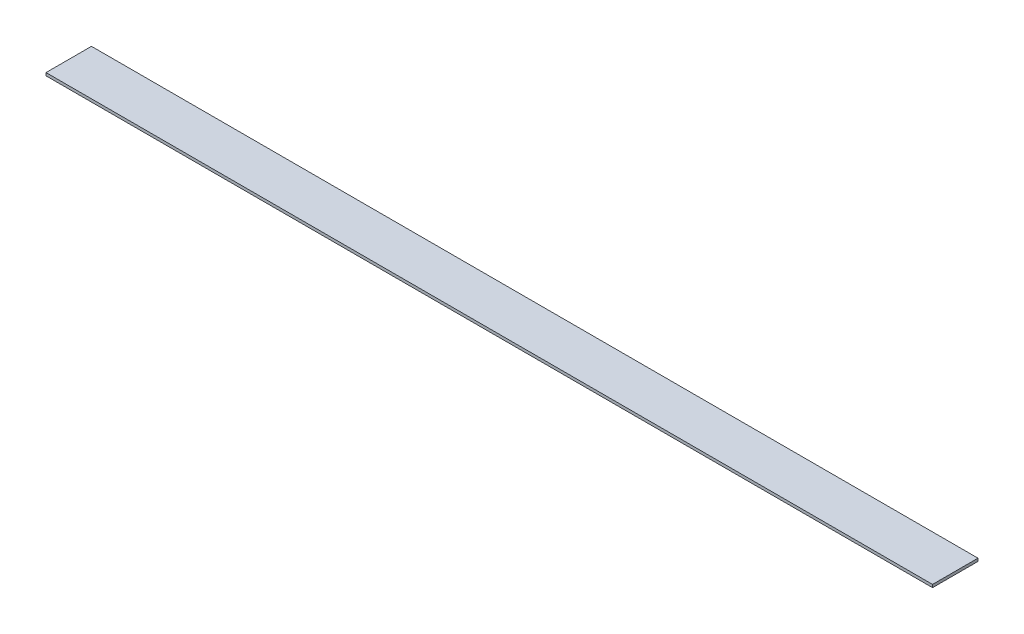
ISO-10303-21;
HEADER;
FILE_DESCRIPTION(('STEP AP214'),'2;1');
FILE_NAME('part.step','',(''),(''),'','','');
FILE_SCHEMA(('AUTOMOTIVE_DESIGN { 1 0 10303 214 1 1 1 1 }'));
ENDSEC;
DATA;
#1=APPLICATION_CONTEXT('core data for automotive mechanical design processes');
#2=APPLICATION_PROTOCOL_DEFINITION('international standard','automotive_design',2000,#1);
#3=PRODUCT_CONTEXT('',#1,'mechanical');
#4=PRODUCT('Part','Part','',(#3));
#5=PRODUCT_RELATED_PRODUCT_CATEGORY('part','',(#4));
#6=PRODUCT_DEFINITION_FORMATION('','',#4);
#7=PRODUCT_DEFINITION_CONTEXT('part definition',#1,'design');
#8=PRODUCT_DEFINITION('design','',#6,#7);
#9=PRODUCT_DEFINITION_SHAPE('','',#8);
#10=(LENGTH_UNIT() NAMED_UNIT(*) SI_UNIT(.MILLI.,.METRE.));
#11=(NAMED_UNIT(*) PLANE_ANGLE_UNIT() SI_UNIT($,.RADIAN.));
#12=(NAMED_UNIT(*) SI_UNIT($,.STERADIAN.) SOLID_ANGLE_UNIT());
#13=UNCERTAINTY_MEASURE_WITH_UNIT(LENGTH_MEASURE(1.E-05),#10,'distance_accuracy_value','');
#14=(GEOMETRIC_REPRESENTATION_CONTEXT(3) GLOBAL_UNCERTAINTY_ASSIGNED_CONTEXT((#13)) GLOBAL_UNIT_ASSIGNED_CONTEXT((#10,
#11,#12)) REPRESENTATION_CONTEXT('',''));
#15=CARTESIAN_POINT('',(0.,0.,0.));
#16=DIRECTION('',(0.,0.,1.));
#17=DIRECTION('',(1.,0.,0.));
#18=AXIS2_PLACEMENT_3D('',#15,#16,#17);
#19=CARTESIAN_POINT('',(-495.3,3.175,25.4000000000001));
#20=DIRECTION('',(1.,0.,0.));
#21=DIRECTION('',(0.,0.,-1.));
#22=AXIS2_PLACEMENT_3D('',#19,#20,#21);
#23=PLANE('',#22);
#24=DIRECTION('',(0.,0.,1.));
#25=VECTOR('',#24,1.);
#26=CARTESIAN_POINT('',(-495.3,0.,25.4000000000001));
#27=LINE('',#26,#25);
#28=CARTESIAN_POINT('',(-495.3,0.,-25.3999999999999));
#29=VERTEX_POINT('',#28);
#30=CARTESIAN_POINT('',(-495.3,0.,25.4000000000001));
#31=VERTEX_POINT('',#30);
#32=EDGE_CURVE('E96',#29,#31,#27,.T.);
#33=ORIENTED_EDGE('',*,*,#32,.T.);
#34=DIRECTION('',(0.,-1.,0.));
#35=VECTOR('',#34,1.);
#36=CARTESIAN_POINT('',(-495.3,3.175,25.4000000000001));
#37=LINE('',#36,#35);
#38=CARTESIAN_POINT('',(-495.3,3.175,25.4000000000001));
#39=VERTEX_POINT('',#38);
#40=EDGE_CURVE('E11',#39,#31,#37,.T.);
#41=ORIENTED_EDGE('',*,*,#40,.F.);
#42=DIRECTION('',(0.,0.,1.));
#43=VECTOR('',#42,1.);
#44=CARTESIAN_POINT('',(-495.3,3.175,25.4000000000001));
#45=LINE('',#44,#43);
#46=CARTESIAN_POINT('',(-495.3,3.175,-25.3999999999999));
#47=VERTEX_POINT('',#46);
#48=EDGE_CURVE('E84',#47,#39,#45,.T.);
#49=ORIENTED_EDGE('',*,*,#48,.F.);
#50=DIRECTION('',(0.,-1.,0.));
#51=VECTOR('',#50,1.);
#52=CARTESIAN_POINT('',(-495.3,3.175,-25.3999999999999));
#53=LINE('',#52,#51);
#54=EDGE_CURVE('E92',#47,#29,#53,.T.);
#55=ORIENTED_EDGE('',*,*,#54,.T.);
#56=EDGE_LOOP('',(#33,#41,#49,#55));
#57=FACE_BOUND('',#56,.T.);
#58=ADVANCED_FACE('F33',(#57),#23,.F.);
#59=CARTESIAN_POINT('',(495.3,3.175,25.3999999999999));
#60=DIRECTION('',(0.,0.,-1.));
#61=DIRECTION('',(-1.,0.,0.));
#62=AXIS2_PLACEMENT_3D('',#59,#60,#61);
#63=PLANE('',#62);
#64=DIRECTION('',(1.,0.,0.));
#65=VECTOR('',#64,1.);
#66=CARTESIAN_POINT('',(495.3,0.,25.3999999999999));
#67=LINE('',#66,#65);
#68=CARTESIAN_POINT('',(495.3,0.,25.3999999999999));
#69=VERTEX_POINT('',#68);
#70=EDGE_CURVE('E88',#31,#69,#67,.T.);
#71=ORIENTED_EDGE('',*,*,#70,.T.);
#72=DIRECTION('',(0.,-1.,0.));
#73=VECTOR('',#72,1.);
#74=CARTESIAN_POINT('',(495.3,3.175,25.3999999999999));
#75=LINE('',#74,#73);
#76=CARTESIAN_POINT('',(495.3,3.175,25.3999999999999));
#77=VERTEX_POINT('',#76);
#78=EDGE_CURVE('E41',#77,#69,#75,.T.);
#79=ORIENTED_EDGE('',*,*,#78,.F.);
#80=DIRECTION('',(1.,0.,0.));
#81=VECTOR('',#80,1.);
#82=CARTESIAN_POINT('',(495.3,3.175,25.3999999999999));
#83=LINE('',#82,#81);
#84=EDGE_CURVE('E79',#39,#77,#83,.T.);
#85=ORIENTED_EDGE('',*,*,#84,.F.);
#86=ORIENTED_EDGE('',*,*,#40,.T.);
#87=EDGE_LOOP('',(#71,#79,#85,#86));
#88=FACE_BOUND('',#87,.T.);
#89=ADVANCED_FACE('F87',(#88),#63,.F.);
#90=CARTESIAN_POINT('',(495.3,3.175,25.3999999999999));
#91=DIRECTION('',(-1.,0.,0.));
#92=DIRECTION('',(0.,0.,1.));
#93=AXIS2_PLACEMENT_3D('',#90,#91,#92);
#94=PLANE('',#93);
#95=DIRECTION('',(0.,0.,-1.));
#96=VECTOR('',#95,1.);
#97=CARTESIAN_POINT('',(495.3,0.,25.3999999999999));
#98=LINE('',#97,#96);
#99=CARTESIAN_POINT('',(495.3,0.,-25.4000000000001));
#100=VERTEX_POINT('',#99);
#101=EDGE_CURVE('E66',#69,#100,#98,.T.);
#102=ORIENTED_EDGE('',*,*,#101,.T.);
#103=DIRECTION('',(0.,-1.,0.));
#104=VECTOR('',#103,1.);
#105=CARTESIAN_POINT('',(495.3,3.175,-25.4000000000001));
#106=LINE('',#105,#104);
#107=CARTESIAN_POINT('',(495.3,3.175,-25.4000000000001));
#108=VERTEX_POINT('',#107);
#109=EDGE_CURVE('E89',#108,#100,#106,.T.);
#110=ORIENTED_EDGE('',*,*,#109,.F.);
#111=DIRECTION('',(0.,0.,-1.));
#112=VECTOR('',#111,1.);
#113=CARTESIAN_POINT('',(495.3,3.175,25.3999999999999));
#114=LINE('',#113,#112);
#115=EDGE_CURVE('E82',#77,#108,#114,.T.);
#116=ORIENTED_EDGE('',*,*,#115,.F.);
#117=ORIENTED_EDGE('',*,*,#78,.T.);
#118=EDGE_LOOP('',(#102,#110,#116,#117));
#119=FACE_BOUND('',#118,.T.);
#120=ADVANCED_FACE('F90',(#119),#94,.F.);
#121=CARTESIAN_POINT('',(495.3,3.175,-25.4000000000001));
#122=DIRECTION('',(0.,0.,1.));
#123=DIRECTION('',(1.,0.,0.));
#124=AXIS2_PLACEMENT_3D('',#121,#122,#123);
#125=PLANE('',#124);
#126=DIRECTION('',(-1.,0.,0.));
#127=VECTOR('',#126,1.);
#128=CARTESIAN_POINT('',(495.3,0.,-25.4000000000001));
#129=LINE('',#128,#127);
#130=EDGE_CURVE('E72',#100,#29,#129,.T.);
#131=ORIENTED_EDGE('',*,*,#130,.T.);
#132=ORIENTED_EDGE('',*,*,#54,.F.);
#133=DIRECTION('',(-1.,0.,0.));
#134=VECTOR('',#133,1.);
#135=CARTESIAN_POINT('',(495.3,3.175,-25.4000000000001));
#136=LINE('',#135,#134);
#137=EDGE_CURVE('E49',#108,#47,#136,.T.);
#138=ORIENTED_EDGE('',*,*,#137,.F.);
#139=ORIENTED_EDGE('',*,*,#109,.T.);
#140=EDGE_LOOP('',(#131,#132,#138,#139));
#141=FACE_BOUND('',#140,.T.);
#142=ADVANCED_FACE('F103',(#141),#125,.F.);
#143=CARTESIAN_POINT('',(0.,3.175,0.));
#144=DIRECTION('',(0.,1.,0.));
#145=DIRECTION('',(0.,0.,1.));
#146=AXIS2_PLACEMENT_3D('',#143,#144,#145);
#147=PLANE('',#146);
#148=ORIENTED_EDGE('',*,*,#48,.T.);
#149=ORIENTED_EDGE('',*,*,#84,.T.);
#150=ORIENTED_EDGE('',*,*,#115,.T.);
#151=ORIENTED_EDGE('',*,*,#137,.T.);
#152=EDGE_LOOP('',(#148,#149,#150,#151));
#153=FACE_BOUND('',#152,.T.);
#154=ADVANCED_FACE('F80',(#153),#147,.T.);
#155=CARTESIAN_POINT('',(0.,0.,0.));
#156=DIRECTION('',(0.,1.,0.));
#157=DIRECTION('',(0.,0.,1.));
#158=AXIS2_PLACEMENT_3D('',#155,#156,#157);
#159=PLANE('',#158);
#160=ORIENTED_EDGE('',*,*,#32,.F.);
#161=ORIENTED_EDGE('',*,*,#130,.F.);
#162=ORIENTED_EDGE('',*,*,#101,.F.);
#163=ORIENTED_EDGE('',*,*,#70,.F.);
#164=EDGE_LOOP('',(#160,#161,#162,#163));
#165=FACE_BOUND('',#164,.T.);
#166=ADVANCED_FACE('F106',(#165),#159,.F.);
#167=CLOSED_SHELL('',(#58,#89,#120,#142,#154,#166));
#168=MANIFOLD_SOLID_BREP('B2',#167);
#169=ADVANCED_BREP_SHAPE_REPRESENTATION('',(#18,#168),#14);
#170=SHAPE_DEFINITION_REPRESENTATION(#9,#169);
ENDSEC;
END-ISO-10303-21;
